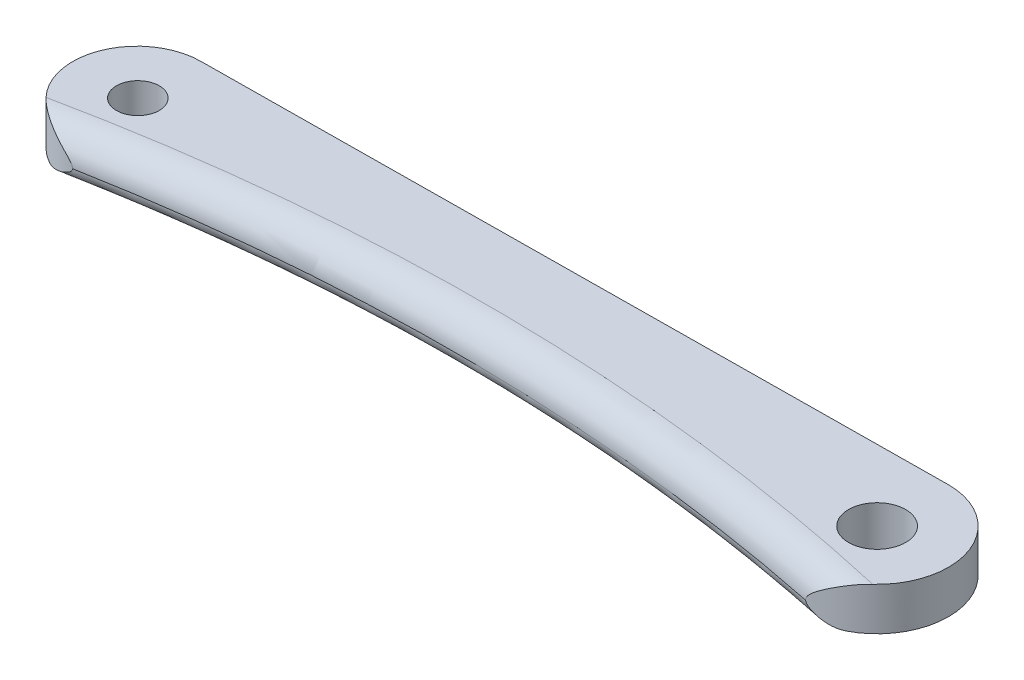
ISO-10303-21;
HEADER;
FILE_DESCRIPTION(('STEP AP214'),'2;1');
FILE_NAME('part.step','',(''),(''),'','','');
FILE_SCHEMA(('AUTOMOTIVE_DESIGN { 1 0 10303 214 1 1 1 1 }'));
ENDSEC;
DATA;
#1=APPLICATION_CONTEXT('core data for automotive mechanical design processes');
#2=APPLICATION_PROTOCOL_DEFINITION('international standard','automotive_design',2000,#1);
#3=PRODUCT_CONTEXT('',#1,'mechanical');
#4=PRODUCT('Part','Part','',(#3));
#5=PRODUCT_RELATED_PRODUCT_CATEGORY('part','',(#4));
#6=PRODUCT_DEFINITION_FORMATION('','',#4);
#7=PRODUCT_DEFINITION_CONTEXT('part definition',#1,'design');
#8=PRODUCT_DEFINITION('design','',#6,#7);
#9=PRODUCT_DEFINITION_SHAPE('','',#8);
#10=(LENGTH_UNIT() NAMED_UNIT(*) SI_UNIT(.MILLI.,.METRE.));
#11=(NAMED_UNIT(*) PLANE_ANGLE_UNIT() SI_UNIT($,.RADIAN.));
#12=(NAMED_UNIT(*) SI_UNIT($,.STERADIAN.) SOLID_ANGLE_UNIT());
#13=UNCERTAINTY_MEASURE_WITH_UNIT(LENGTH_MEASURE(1.E-05),#10,'distance_accuracy_value','');
#14=(GEOMETRIC_REPRESENTATION_CONTEXT(3) GLOBAL_UNCERTAINTY_ASSIGNED_CONTEXT((#13)) GLOBAL_UNIT_ASSIGNED_CONTEXT((#10,
#11,#12)) REPRESENTATION_CONTEXT('',''));
#15=CARTESIAN_POINT('',(0.,0.,0.));
#16=DIRECTION('',(0.,0.,1.));
#17=DIRECTION('',(1.,0.,0.));
#18=AXIS2_PLACEMENT_3D('',#15,#16,#17);
#19=CARTESIAN_POINT('',(24.616944980695,1.,137.6745));
#20=DIRECTION('',(0.,1.,0.));
#21=DIRECTION('',(0.,0.,1.));
#22=AXIS2_PLACEMENT_3D('',#19,#20,#21);
#23=TOROIDAL_SURFACE('',#22,136.430577900386,1.);
#24=CARTESIAN_POINT('',(24.616944980695,1.,137.6745));
#25=DIRECTION('',(0.,1.,0.));
#26=DIRECTION('',(0.,0.,1.));
#27=AXIS2_PLACEMENT_3D('',#24,#25,#26);
#28=CIRCLE('',#27,135.430577900386);
#29=CARTESIAN_POINT('',(51.8,1.00000000000013,5.));
#30=VERTEX_POINT('',#29);
#31=CARTESIAN_POINT('',(0.,1.,4.5));
#32=VERTEX_POINT('',#31);
#33=EDGE_CURVE('E102',#30,#32,#28,.T.);
#34=ORIENTED_EDGE('',*,*,#33,.T.);
#35=CARTESIAN_POINT('',(-2.22624692483043,0.,3.9107319813154));
#36=CARTESIAN_POINT('',(-2.16803196142417,2.42171631782831E-05,3.94388281091818));
#37=CARTESIAN_POINT('',(-2.10912387109141,0.0028956414787861,3.97568529853656));
#38=CARTESIAN_POINT('',(-1.9904022485435,0.0135807149759644,4.03642339313016));
#39=CARTESIAN_POINT('',(-1.93059040520456,0.0213860465112248,4.06536373038647));
#40=CARTESIAN_POINT('',(-1.81030235527459,0.0411986537468926,4.12033852220439));
#41=CARTESIAN_POINT('',(-1.74982571943408,0.0532088201405405,4.14637096139502));
#42=CARTESIAN_POINT('',(-1.62848960602747,0.0808604566737591,4.19551045488819));
#43=CARTESIAN_POINT('',(-1.56762994348653,0.096503837326293,4.21861596015936));
#44=CARTESIAN_POINT('',(-1.41706518136261,0.139055686671996,4.2721154636808));
#45=CARTESIAN_POINT('',(-1.32727307556081,0.167799909100152,4.30081759691567));
#46=CARTESIAN_POINT('',(-1.14794268339514,0.23104389414821,4.35211872317752));
#47=CARTESIAN_POINT('',(-1.05840460264225,0.265547427179469,4.37471369251755));
#48=CARTESIAN_POINT('',(-0.880316664175526,0.339690015696575,4.41399269174236));
#49=CARTESIAN_POINT('',(-0.791765501601624,0.37932111486797,4.43068573275245));
#50=CARTESIAN_POINT('',(-0.660304807149358,0.442817294257837,4.45151305215598));
#51=CARTESIAN_POINT('',(-0.616728549717826,0.46464854541407,4.45775188002719));
#52=CARTESIAN_POINT('',(-0.530208291975668,0.5098499514004,4.46886763044085));
#53=CARTESIAN_POINT('',(-0.487264146520685,0.533219745989242,4.47374487039973));
#54=CARTESIAN_POINT('',(-0.410862755680278,0.576971564818728,4.48133418549618));
#55=CARTESIAN_POINT('',(-0.377232634322555,0.597010788162913,4.48428438711307));
#56=CARTESIAN_POINT('',(-0.310815524196229,0.638692268054609,4.48937650031995));
#57=CARTESIAN_POINT('',(-0.278030086794347,0.660337225234645,4.49151701148303));
#58=CARTESIAN_POINT('',(-0.214139264382031,0.705714980437638,4.49501565285995));
#59=CARTESIAN_POINT('',(-0.183026527479306,0.729437185719249,4.49637751320429));
#60=CARTESIAN_POINT('',(-0.123602979962018,0.780221875363413,4.49839755676597));
#61=CARTESIAN_POINT('',(-0.0952801116445299,0.807268736610092,4.49905890063733));
#62=CARTESIAN_POINT('',(-0.0615106925026761,0.847772606854188,4.49958875479429));
#63=CARTESIAN_POINT('',(-0.0531105803101698,0.858713862763939,4.49969342387364));
#64=CARTESIAN_POINT('',(-0.0375699786415387,0.881479219008316,4.49984973381849));
#65=CARTESIAN_POINT('',(-0.0304296478693595,0.893303430308675,4.49990136800672));
#66=CARTESIAN_POINT('',(-0.0178694015559141,0.918112619379095,4.49996903269447));
#67=CARTESIAN_POINT('',(-0.012480008685361,0.931113606096959,4.49998445801709));
#68=CARTESIAN_POINT('',(-0.0043808917696035,0.957919001280434,4.49999974783877));
#69=CARTESIAN_POINT('',(-0.00166073561341566,0.971720056907016,4.49999967316143));
#70=CARTESIAN_POINT('',(0.000384009115784675,0.997744902375465,4.500000217296));
#71=CARTESIAN_POINT('',(0.000107327630633194,1.00993802413004,4.50000074639382));
#72=CARTESIAN_POINT('',(-0.00278711724042367,1.03422094180469,4.49999884735859));
#73=CARTESIAN_POINT('',(-0.00543785354551768,1.0463068531368,4.49999637739962));
#74=CARTESIAN_POINT('',(-0.00921223452798543,1.05801114783593,4.49999057051623));
#75=B_SPLINE_CURVE_WITH_KNOTS('',3,(#35,#36,#37,#38,#39,#40,#41,#42,#43,#44,#45,#46,#47,#48,#49,
#50,#51,#52,#53,#54,#55,#56,#57,#58,#59,#60,#61,#62,#63,#64,#65,#66,#67,#68,#69,#70,#71,#72,#73,
#74),.UNSPECIFIED.,.F.,.F.,(4,2,2,2,2,2,2,2,2,2,2,2,2,2,2,2,2,2,2,4),(0.,0.200806754745089,
0.401275886329909,0.60188310570669,0.802596053484626,1.09783088958517,1.39325976875211,
1.68823561610348,1.835611581135,1.98295316080637,2.10069795732786,2.21864548209201,
2.33602313971435,2.45286891640173,2.49419015574632,2.53551659692067,2.57752897654554,
2.61937649839522,2.65573277149919,2.69260195898539),.UNSPECIFIED.);
#76=CARTESIAN_POINT('',(-2.22624692483043,0.,3.9107319813154));
#77=VERTEX_POINT('',#76);
#78=EDGE_CURVE('E12',#77,#32,#75,.T.);
#79=ORIENTED_EDGE('',*,*,#78,.F.);
#80=CARTESIAN_POINT('',(24.616944980695,0.,137.6745));
#81=DIRECTION('',(0.,1.,0.));
#82=DIRECTION('',(0.,0.,1.));
#83=AXIS2_PLACEMENT_3D('',#80,#81,#82);
#84=CIRCLE('',#83,136.430577900386);
#85=CARTESIAN_POINT('',(54.0617013237156,0.,4.45922718890874));
#86=VERTEX_POINT('',#85);
#87=EDGE_CURVE('E47',#86,#77,#84,.T.);
#88=ORIENTED_EDGE('',*,*,#87,.F.);
#89=CARTESIAN_POINT('',(51.7999999999999,1.00000000000013,5.));
#90=CARTESIAN_POINT('',(51.7999559988183,0.987175402377328,4.9999987063473));
#91=CARTESIAN_POINT('',(51.8012277738419,0.974416398541732,5.00000010153782));
#92=CARTESIAN_POINT('',(51.8059676585103,0.949520714592626,4.99999730538752));
#93=CARTESIAN_POINT('',(51.8093992999422,0.937377250382461,4.99999320555364));
#94=CARTESIAN_POINT('',(51.8196822087669,0.909303513344271,4.99996457687972));
#95=CARTESIAN_POINT('',(51.827335559749,0.893675574032456,4.99993291604698));
#96=CARTESIAN_POINT('',(51.8449486640246,0.863678984547503,4.9998058307698));
#97=CARTESIAN_POINT('',(51.8549262865243,0.849321345194542,4.99970990091287));
#98=CARTESIAN_POINT('',(51.8795727892077,0.81767207394208,4.99938604088421));
#99=CARTESIAN_POINT('',(51.8947525280233,0.800785958368108,4.99912722950883));
#100=CARTESIAN_POINT('',(51.9266456787659,0.768515485314868,4.99842161242411));
#101=CARTESIAN_POINT('',(51.9433622401645,0.753134351396008,4.99797441361467));
#102=CARTESIAN_POINT('',(51.9950948568139,0.708588179313152,4.9963108434222));
#103=CARTESIAN_POINT('',(52.0315760524555,0.681152320401152,4.99477349135711));
#104=CARTESIAN_POINT('',(52.1014701169754,0.632600887554081,4.99101052694932));
#105=CARTESIAN_POINT('',(52.1346534573106,0.611128924270308,4.98890236815499));
#106=CARTESIAN_POINT('',(52.2019636801827,0.569801137168604,4.9839304887849));
#107=CARTESIAN_POINT('',(52.2360906978652,0.549945546456947,4.98106665948131));
#108=CARTESIAN_POINT('',(52.3395417005954,0.492203332450051,4.97128684786883));
#109=CARTESIAN_POINT('',(52.4098155565733,0.456219986650691,4.96318864293227));
#110=CARTESIAN_POINT('',(52.55179524957,0.388067120826566,4.94367847251809));
#111=CARTESIAN_POINT('',(52.6235024147318,0.355901349786676,4.93226328696571));
#112=CARTESIAN_POINT('',(52.7677088097081,0.295123072056276,4.90600700594135));
#113=CARTESIAN_POINT('',(52.8402072027505,0.266507145215492,4.89116924804526));
#114=CARTESIAN_POINT('',(52.9855407816728,0.212909693542131,4.85798691723392));
#115=CARTESIAN_POINT('',(53.0583747521827,0.187919664807766,4.83965079106857));
#116=CARTESIAN_POINT('',(53.2042940101168,0.14179539604979,4.7993426763248));
#117=CARTESIAN_POINT('',(53.2773793748726,0.120662475707078,4.77736944822406));
#118=CARTESIAN_POINT('',(53.4230751303446,0.0828825856393767,4.72984792052288));
#119=CARTESIAN_POINT('',(53.4956858474793,0.0662106571556643,4.70432078074652));
#120=CARTESIAN_POINT('',(53.6404913267055,0.0378961553149177,4.64957952833444));
#121=CARTESIAN_POINT('',(53.7126861091027,0.0262533343515136,4.62036559730816));
#122=CARTESIAN_POINT('',(53.8791074189494,0.00612848978246462,4.54839579489708));
#123=CARTESIAN_POINT('',(53.9730502958901,-0.000175848732147435,4.50428552397702));
#124=CARTESIAN_POINT('',(54.1120941074347,9.41218296800092E-05,4.43361728809853));
#125=CARTESIAN_POINT('',(54.1583165864682,0.00183269457594044,4.40920084379839));
#126=CARTESIAN_POINT('',(54.2498123933503,0.00903809327004083,4.35903134657077));
#127=CARTESIAN_POINT('',(54.2950843078079,0.0145101145892124,4.33327647732466));
#128=CARTESIAN_POINT('',(54.339723627424,0.0220633748222029,4.30694832756379));
#129=B_SPLINE_CURVE_WITH_KNOTS('',3,(#89,#90,#91,#92,#93,#94,#95,#96,#97,#98,#99,#100,#101,#102,
#103,#104,#105,#106,#107,#108,#109,#110,#111,#112,#113,#114,#115,#116,#117,#118,#119,#120,#121,
#122,#123,#124,#125,#126,#127,#128),.UNSPECIFIED.,.F.,.F.,(4,2,2,2,2,2,2,2,2,2,2,2,2,2,2,2,2,2,
2,4),(0.,0.0383058435442699,0.0759816524406598,0.127889414839791,0.180210248317969,
0.248167535665362,0.316267334566423,0.4529925042749,0.571692904116078,0.690410392201524,
0.928275000745676,1.16637130056692,1.40423639129747,1.64153426716498,1.87891318115535,
2.11493481592809,2.35094482893235,2.66189836997958,2.81867080052313,2.97566183772119),.UNSPECIFIED.);
#130=EDGE_CURVE('E154',#30,#86,#129,.T.);
#131=ORIENTED_EDGE('',*,*,#130,.F.);
#132=EDGE_LOOP('',(#34,#79,#88,#131));
#133=FACE_BOUND('',#132,.T.);
#134=ADVANCED_FACE('F35',(#133),#23,.T.);
#135=CARTESIAN_POINT('',(24.616944980695,1.,137.6745));
#136=DIRECTION('',(0.,1.,0.));
#137=DIRECTION('',(0.,0.,1.));
#138=AXIS2_PLACEMENT_3D('',#135,#136,#137);
#139=TOROIDAL_SURFACE('',#138,137.430577900386,2.);
#140=ORIENTED_EDGE('',*,*,#33,.F.);
#141=CARTESIAN_POINT('',(55.179170688117,3.,3.68526870941198));
#142=CARTESIAN_POINT('',(55.1159229429357,2.99999481933412,3.74328639692364));
#143=CARTESIAN_POINT('',(55.0512119671688,2.99626071571403,3.79960204284192));
#144=CARTESIAN_POINT('',(54.9195381227405,2.98214700773226,3.90841608687958));
#145=CARTESIAN_POINT('',(54.852579585343,2.97177955998762,3.96092127266407));
#146=CARTESIAN_POINT('',(54.7177372805287,2.94537935449713,4.06125532239149));
#147=CARTESIAN_POINT('',(54.6498770564928,2.929422440967,4.10913635202487));
#148=CARTESIAN_POINT('',(54.5127892968723,2.89250455100303,4.2009023387452));
#149=CARTESIAN_POINT('',(54.4435610003267,2.87154071336119,4.2447849910776));
#150=CARTESIAN_POINT('',(54.2799331618191,2.81719151354904,4.34303212362));
#151=CARTESIAN_POINT('',(54.1851354487382,2.78202016742679,4.39574945935869));
#152=CARTESIAN_POINT('',(53.9945083460966,2.70498976013333,4.49395597560691));
#153=CARTESIAN_POINT('',(53.8986785285522,2.66312781649614,4.53944202378402));
#154=CARTESIAN_POINT('',(53.7057488420745,2.57331618223374,4.62377587740515));
#155=CARTESIAN_POINT('',(53.6086453198939,2.52531491805368,4.66256001003192));
#156=CARTESIAN_POINT('',(53.4146152937753,2.42429900968213,4.73325218361756));
#157=CARTESIAN_POINT('',(53.3176887366448,2.37128627493276,4.76516282840144));
#158=CARTESIAN_POINT('',(53.1208746092861,2.25861667913632,4.82350611032762));
#159=CARTESIAN_POINT('',(53.021012836432,2.19878488452465,4.84968747739433));
#160=CARTESIAN_POINT('',(52.8226469598733,2.0742290516696,4.89536207339637));
#161=CARTESIAN_POINT('',(52.7241448048733,2.00949871081684,4.91484650100954));
#162=CARTESIAN_POINT('',(52.5306364215458,1.87527283264607,4.94728819513373));
#163=CARTESIAN_POINT('',(52.4356063385429,1.80582671795867,4.96030397009618));
#164=CARTESIAN_POINT('',(52.2970815559914,1.69618935362546,4.97544744386267));
#165=CARTESIAN_POINT('',(52.2516223547528,1.65877438064956,4.97976299374628));
#166=CARTESIAN_POINT('',(52.1627274451337,1.58150492424973,4.98702357077112));
#167=CARTESIAN_POINT('',(52.1192902337507,1.54165230548819,4.98996963101922));
#168=CARTESIAN_POINT('',(52.0501145860273,1.47276690001795,4.99381624134142));
#169=CARTESIAN_POINT('',(52.0234215460558,1.44471935287894,4.99507181129693));
#170=CARTESIAN_POINT('',(51.9721028869513,1.38654632983971,4.9971031477401));
#171=CARTESIAN_POINT('',(51.9474855986659,1.35641328962607,4.9978770536244));
#172=CARTESIAN_POINT('',(51.9013325192451,1.29308884116162,4.99902694700277));
#173=CARTESIAN_POINT('',(51.879850067623,1.25985745475778,4.99939661793745));
#174=CARTESIAN_POINT('',(51.8429719805347,1.19036203983548,4.99984909168904));
#175=CARTESIAN_POINT('',(51.8275179226604,1.15413146656946,4.99993471152447));
#176=CARTESIAN_POINT('',(51.810298969956,1.09380471650876,4.99999425471497));
#177=CARTESIAN_POINT('',(51.8055364318497,1.07058689191634,4.99999898871853));
#178=CARTESIAN_POINT('',(51.7999473944921,1.0233137238559,4.99999948772581));
#179=CARTESIAN_POINT('',(51.7991859442435,0.999250905134058,4.99999510611064));
#180=CARTESIAN_POINT('',(51.8007632686115,0.975240894652573,4.9999999417421));
#181=B_SPLINE_CURVE_WITH_KNOTS('',3,(#141,#142,#143,#144,#145,#146,#147,#148,#149,#150,#151,
#152,#153,#154,#155,#156,#157,#158,#159,#160,#161,#162,#163,#164,#165,#166,#167,#168,#169,#170,
#171,#172,#173,#174,#175,#176,#177,#178,#179,#180),.UNSPECIFIED.,.F.,.F.,(4,2,2,2,2,2,2,2,2,2,2,
2,2,2,2,2,2,2,2,4),(0.,0.257268129629723,0.514066121323012,0.767506569513693,1.02109219430181,
1.36267802921334,1.70441142596798,2.04923161494704,2.39392094799241,2.75157860618292,
3.10970452760377,3.46452943577572,3.64157017571894,3.81847714318946,3.93462135679894,
4.05121147968662,4.16959849382825,4.28680786251461,4.35758788907899,4.42951516277919),.UNSPECIFIED.);
#182=CARTESIAN_POINT('',(55.179170688117,3.,3.68526870941198));
#183=VERTEX_POINT('',#182);
#184=EDGE_CURVE('E149',#183,#30,#181,.T.);
#185=ORIENTED_EDGE('',*,*,#184,.F.);
#186=CARTESIAN_POINT('',(24.616944980695,3.,137.6745));
#187=DIRECTION('',(0.,1.,0.));
#188=DIRECTION('',(0.,0.,1.));
#189=AXIS2_PLACEMENT_3D('',#186,#187,#188);
#190=CIRCLE('',#189,137.430577900386);
#191=CARTESIAN_POINT('',(-3.26083189496921,3.,3.10112485281575));
#192=VERTEX_POINT('',#191);
#193=EDGE_CURVE('E89',#192,#183,#190,.F.);
#194=ORIENTED_EDGE('',*,*,#193,.F.);
#195=CARTESIAN_POINT('',(2.05187685361144E-13,1.,4.5));
#196=CARTESIAN_POINT('',(0.000105215794035733,1.02476925164426,4.49999459809834));
#197=CARTESIAN_POINT('',(-0.0025298652948166,1.04936001533275,4.50000062029043));
#198=CARTESIAN_POINT('',(-0.012171592814855,1.09716468143189,4.49998734612933));
#199=CARTESIAN_POINT('',(-0.0190863025297015,1.12039657317255,4.49996857305866));
#200=CARTESIAN_POINT('',(-0.0402989855534702,1.17615597501097,4.49983600515036));
#201=CARTESIAN_POINT('',(-0.0565401781057808,1.20791272057776,4.49968164911853));
#202=CARTESIAN_POINT('',(-0.0934755137653292,1.26904276099404,4.49906801190616));
#203=CARTESIAN_POINT('',(-0.114217961944437,1.29838502185107,4.49860530031251));
#204=CARTESIAN_POINT('',(-0.172477614742557,1.37320954484304,4.49683771710686));
#205=CARTESIAN_POINT('',(-0.212201732576446,1.41693107976089,4.49518256172003));
#206=CARTESIAN_POINT('',(-0.295098807337685,1.50094376951325,4.49050863569963));
#207=CARTESIAN_POINT('',(-0.338280552202158,1.54122560877682,4.48748629344408));
#208=CARTESIAN_POINT('',(-0.42676551761521,1.61952618299789,4.47993833801163));
#209=CARTESIAN_POINT('',(-0.472075081855962,1.65753726742775,4.47540794760775));
#210=CARTESIAN_POINT('',(-0.563891698023222,1.73171998004738,4.46476950128661));
#211=CARTESIAN_POINT('',(-0.610397343765677,1.76789363176549,4.4586632280119));
#212=CARTESIAN_POINT('',(-0.765147115808477,1.88487195987099,4.43580888146256));
#213=CARTESIAN_POINT('',(-0.875176842951073,1.96266382292513,4.41553545310959));
#214=CARTESIAN_POINT('',(-1.09724570022232,2.11237968764182,4.36566887410921));
#215=CARTESIAN_POINT('',(-1.20928697026066,2.18429692570062,4.33606516652697));
#216=CARTESIAN_POINT('',(-1.43384456078392,2.32186481296055,4.26706541592752));
#217=CARTESIAN_POINT('',(-1.54635910230782,2.38753004959685,4.22769298105942));
#218=CARTESIAN_POINT('',(-1.77104508586655,2.51184625051008,4.13859827958693));
#219=CARTESIAN_POINT('',(-1.88321674024875,2.57050322150966,4.08888497769951));
#220=CARTESIAN_POINT('',(-2.13739644870769,2.69458841329829,3.96318756311508));
#221=CARTESIAN_POINT('',(-2.27902802749552,2.75736427086557,3.88374228884946));
#222=CARTESIAN_POINT('',(-2.55716678398448,2.86455037425043,3.70646331975199));
#223=CARTESIAN_POINT('',(-2.69369335375538,2.90903832158002,3.60871004650351));
#224=CARTESIAN_POINT('',(-2.87754781734653,2.95411677163155,3.46036930806297));
#225=CARTESIAN_POINT('',(-2.92857200630546,2.96494233953057,3.41730391887934));
#226=CARTESIAN_POINT('',(-3.02903309795288,2.98248396447107,3.3285793760516));
#227=CARTESIAN_POINT('',(-3.07847070086377,2.98920185869571,3.28292139196267));
#228=CARTESIAN_POINT('',(-3.17587169686235,2.99813610466408,3.18880182361722));
#229=CARTESIAN_POINT('',(-3.22381885171535,3.00031343786831,3.14031958909397));
#230=CARTESIAN_POINT('',(-3.31750985185635,2.9996127428148,3.0411866094801));
#231=CARTESIAN_POINT('',(-3.36325056351318,2.99672773021214,2.99053296264705));
#232=CARTESIAN_POINT('',(-3.40768033339295,2.99108877267361,2.93899893593157));
#233=B_SPLINE_CURVE_WITH_KNOTS('',3,(#195,#196,#197,#198,#199,#200,#201,#202,#203,#204,#205,
#206,#207,#208,#209,#210,#211,#212,#213,#214,#215,#216,#217,#218,#219,#220,#221,#222,#223,#224,
#225,#226,#227,#228,#229,#230,#231,#232),.UNSPECIFIED.,.F.,.F.,(4,2,2,2,2,2,2,2,2,2,2,2,2,2,2,2,
2,2,4),(0.,0.0738848298879506,0.146235029831824,0.252634652556451,0.36023816835541,
0.537066703860971,0.714359875883279,0.892220112316175,1.06988002802908,1.47813663824047,
1.88685684716217,2.29459875960808,2.70198865423507,3.22265698239322,3.74108964650981,
3.94386012870148,4.14653985404177,4.35095421453034,4.55565082029057),.UNSPECIFIED.);
#234=EDGE_CURVE('E126',#32,#192,#233,.T.);
#235=ORIENTED_EDGE('',*,*,#234,.F.);
#236=EDGE_LOOP('',(#140,#185,#194,#235));
#237=FACE_BOUND('',#236,.T.);
#238=ADVANCED_FACE('F133',(#237),#139,.T.);
#239=CARTESIAN_POINT('',(51.8,3.,0.));
#240=DIRECTION('',(0.,-1.,0.));
#241=DIRECTION('',(0.,0.,-1.));
#242=AXIS2_PLACEMENT_3D('',#239,#240,#241);
#243=CYLINDRICAL_SURFACE('',#242,5.);
#244=ORIENTED_EDGE('',*,*,#184,.T.);
#245=ORIENTED_EDGE('',*,*,#130,.T.);
#246=CARTESIAN_POINT('',(51.8,0.,0.));
#247=DIRECTION('',(0.,1.,0.));
#248=DIRECTION('',(0.,0.,1.));
#249=AXIS2_PLACEMENT_3D('',#246,#247,#248);
#250=CIRCLE('',#249,5.);
#251=CARTESIAN_POINT('',(51.8,0.,-5.));
#252=VERTEX_POINT('',#251);
#253=EDGE_CURVE('E98',#86,#252,#250,.T.);
#254=ORIENTED_EDGE('',*,*,#253,.T.);
#255=DIRECTION('',(0.,-1.,0.));
#256=VECTOR('',#255,1.);
#257=CARTESIAN_POINT('',(51.8,3.,-5.));
#258=LINE('',#257,#256);
#259=CARTESIAN_POINT('',(51.8,3.,-5.));
#260=VERTEX_POINT('',#259);
#261=EDGE_CURVE('E95',#260,#252,#258,.T.);
#262=ORIENTED_EDGE('',*,*,#261,.F.);
#263=CARTESIAN_POINT('',(51.8,3.,0.));
#264=DIRECTION('',(0.,1.,0.));
#265=DIRECTION('',(0.,0.,1.));
#266=AXIS2_PLACEMENT_3D('',#263,#264,#265);
#267=CIRCLE('',#266,5.);
#268=EDGE_CURVE('E82',#183,#260,#267,.T.);
#269=ORIENTED_EDGE('',*,*,#268,.F.);
#270=EDGE_LOOP('',(#244,#245,#254,#262,#269));
#271=FACE_BOUND('',#270,.T.);
#272=ADVANCED_FACE('F96',(#271),#243,.T.);
#273=CARTESIAN_POINT('',(-0.0434322468129188,3.,-4.49958076981841));
#274=DIRECTION('',(-0.00965206001721773,0.,-0.999953417783761));
#275=DIRECTION('',(-0.999953417783761,0.,0.00965206001721773));
#276=AXIS2_PLACEMENT_3D('',#273,#274,#275);
#277=PLANE('',#276);
#278=DIRECTION('',(0.999953417783761,0.,-0.00965206001721773));
#279=VECTOR('',#278,1.);
#280=CARTESIAN_POINT('',(-0.0434322468129188,0.,-4.49958076981841));
#281=LINE('',#280,#279);
#282=CARTESIAN_POINT('',(0.,0.,-4.5));
#283=VERTEX_POINT('',#282);
#284=EDGE_CURVE('E116',#283,#252,#281,.T.);
#285=ORIENTED_EDGE('',*,*,#284,.F.);
#286=DIRECTION('',(0.,-1.,0.));
#287=VECTOR('',#286,1.);
#288=CARTESIAN_POINT('',(0.,3.,-4.5));
#289=LINE('',#288,#287);
#290=CARTESIAN_POINT('',(0.,3.,-4.5));
#291=VERTEX_POINT('',#290);
#292=EDGE_CURVE('E103',#291,#283,#289,.T.);
#293=ORIENTED_EDGE('',*,*,#292,.F.);
#294=DIRECTION('',(0.999953417783761,0.,-0.00965206001721773));
#295=VECTOR('',#294,1.);
#296=CARTESIAN_POINT('',(-0.0434322468129188,3.,-4.49958076981841));
#297=LINE('',#296,#295);
#298=EDGE_CURVE('E88',#291,#260,#297,.T.);
#299=ORIENTED_EDGE('',*,*,#298,.T.);
#300=ORIENTED_EDGE('',*,*,#261,.T.);
#301=EDGE_LOOP('',(#285,#293,#299,#300));
#302=FACE_BOUND('',#301,.T.);
#303=ADVANCED_FACE('F105',(#302),#277,.T.);
#304=CARTESIAN_POINT('',(0.,3.,0.));
#305=DIRECTION('',(0.,-1.,0.));
#306=DIRECTION('',(0.,0.,-1.));
#307=AXIS2_PLACEMENT_3D('',#304,#305,#306);
#308=CYLINDRICAL_SURFACE('',#307,4.5);
#309=CARTESIAN_POINT('',(0.,0.,0.));
#310=DIRECTION('',(0.,1.,0.));
#311=DIRECTION('',(0.,0.,1.));
#312=AXIS2_PLACEMENT_3D('',#309,#310,#311);
#313=CIRCLE('',#312,4.5);
#314=EDGE_CURVE('E119',#283,#77,#313,.T.);
#315=ORIENTED_EDGE('',*,*,#314,.T.);
#316=ORIENTED_EDGE('',*,*,#78,.T.);
#317=ORIENTED_EDGE('',*,*,#234,.T.);
#318=CARTESIAN_POINT('',(0.,3.,0.));
#319=DIRECTION('',(0.,1.,0.));
#320=DIRECTION('',(0.,0.,1.));
#321=AXIS2_PLACEMENT_3D('',#318,#319,#320);
#322=CIRCLE('',#321,4.5);
#323=EDGE_CURVE('E107',#291,#192,#322,.T.);
#324=ORIENTED_EDGE('',*,*,#323,.F.);
#325=ORIENTED_EDGE('',*,*,#292,.T.);
#326=EDGE_LOOP('',(#315,#316,#317,#324,#325));
#327=FACE_BOUND('',#326,.T.);
#328=ADVANCED_FACE('F136',(#327),#308,.T.);
#329=CARTESIAN_POINT('',(51.8,3.,0.));
#330=DIRECTION('',(0.,-1.,0.));
#331=DIRECTION('',(0.,0.,-1.));
#332=AXIS2_PLACEMENT_3D('',#329,#330,#331);
#333=CYLINDRICAL_SURFACE('',#332,2.);
#334=CARTESIAN_POINT('',(51.8,3.,0.));
#335=DIRECTION('',(0.,1.,0.));
#336=DIRECTION('',(0.,0.,1.));
#337=AXIS2_PLACEMENT_3D('',#334,#335,#336);
#338=CIRCLE('',#337,2.);
#339=CARTESIAN_POINT('',(51.8,3.,2.));
#340=VERTEX_POINT('',#339);
#341=EDGE_CURVE('E109',#340,#340,#338,.T.);
#342=ORIENTED_EDGE('',*,*,#341,.T.);
#343=EDGE_LOOP('',(#342));
#344=FACE_BOUND('',#343,.T.);
#345=CARTESIAN_POINT('',(51.8,0.,0.));
#346=DIRECTION('',(0.,1.,0.));
#347=DIRECTION('',(0.,0.,1.));
#348=AXIS2_PLACEMENT_3D('',#345,#346,#347);
#349=CIRCLE('',#348,2.);
#350=CARTESIAN_POINT('',(51.8,0.,2.));
#351=VERTEX_POINT('',#350);
#352=EDGE_CURVE('E92',#351,#351,#349,.T.);
#353=ORIENTED_EDGE('',*,*,#352,.F.);
#354=EDGE_LOOP('',(#353));
#355=FACE_BOUND('',#354,.T.);
#356=ADVANCED_FACE('F141',(#344,#355),#333,.F.);
#357=CARTESIAN_POINT('',(0.,3.,0.));
#358=DIRECTION('',(0.,1.,0.));
#359=DIRECTION('',(0.,0.,1.));
#360=AXIS2_PLACEMENT_3D('',#357,#358,#359);
#361=PLANE('',#360);
#362=ORIENTED_EDGE('',*,*,#323,.T.);
#363=ORIENTED_EDGE('',*,*,#193,.T.);
#364=ORIENTED_EDGE('',*,*,#268,.T.);
#365=ORIENTED_EDGE('',*,*,#298,.F.);
#366=EDGE_LOOP('',(#362,#363,#364,#365));
#367=FACE_BOUND('',#366,.T.);
#368=CARTESIAN_POINT('',(3.90750325257866E-05,3.,-0.0636252453191284));
#369=DIRECTION('',(0.,1.,0.));
#370=DIRECTION('',(0.,0.,1.));
#371=AXIS2_PLACEMENT_3D('',#368,#369,#370);
#372=CIRCLE('',#371,1.5);
#373=CARTESIAN_POINT('',(3.90750325257866E-05,3.,-1.56362524531913));
#374=VERTEX_POINT('',#373);
#375=EDGE_CURVE('E117',#374,#374,#372,.F.);
#376=ORIENTED_EDGE('',*,*,#375,.T.);
#377=EDGE_LOOP('',(#376));
#378=FACE_BOUND('',#377,.T.);
#379=ORIENTED_EDGE('',*,*,#341,.F.);
#380=EDGE_LOOP('',(#379));
#381=FACE_BOUND('',#380,.T.);
#382=ADVANCED_FACE('F85',(#367,#378,#381),#361,.T.);
#383=CARTESIAN_POINT('',(0.,0.,0.));
#384=DIRECTION('',(0.,1.,0.));
#385=DIRECTION('',(0.,0.,1.));
#386=AXIS2_PLACEMENT_3D('',#383,#384,#385);
#387=PLANE('',#386);
#388=CARTESIAN_POINT('',(3.90750325257866E-05,0.,-0.0636252453191284));
#389=DIRECTION('',(0.,-1.,0.));
#390=DIRECTION('',(0.,0.,-1.));
#391=AXIS2_PLACEMENT_3D('',#388,#389,#390);
#392=CIRCLE('',#391,1.5);
#393=CARTESIAN_POINT('',(3.90750325257866E-05,0.,-1.56362524531913));
#394=VERTEX_POINT('',#393);
#395=EDGE_CURVE('E252',#394,#394,#392,.T.);
#396=ORIENTED_EDGE('',*,*,#395,.F.);
#397=EDGE_LOOP('',(#396));
#398=FACE_BOUND('',#397,.T.);
#399=ORIENTED_EDGE('',*,*,#253,.F.);
#400=ORIENTED_EDGE('',*,*,#87,.T.);
#401=ORIENTED_EDGE('',*,*,#314,.F.);
#402=ORIENTED_EDGE('',*,*,#284,.T.);
#403=EDGE_LOOP('',(#399,#400,#401,#402));
#404=FACE_BOUND('',#403,.T.);
#405=ORIENTED_EDGE('',*,*,#352,.T.);
#406=EDGE_LOOP('',(#405));
#407=FACE_BOUND('',#406,.T.);
#408=ADVANCED_FACE('F160',(#398,#404,#407),#387,.F.);
#409=CARTESIAN_POINT('',(3.90750325257866E-05,7.24264068711929,-0.0636252453191284));
#410=DIRECTION('',(0.,-1.,0.));
#411=DIRECTION('',(0.,0.,-1.));
#412=AXIS2_PLACEMENT_3D('',#409,#410,#411);
#413=CYLINDRICAL_SURFACE('',#412,1.5);
#414=CARTESIAN_POINT('',(3.90750325257866E-05,0.,-1.56362524531913));
#415=CARTESIAN_POINT('',(3.90750325257866E-05,0.03125,-1.56362524531913));
#416=CARTESIAN_POINT('',(3.90750325257866E-05,0.0625000000000001,-1.56362524531913));
#417=CARTESIAN_POINT('',(3.90750325257866E-05,0.125,-1.56362524531913));
#418=CARTESIAN_POINT('',(3.90750325257866E-05,0.15625,-1.56362524531913));
#419=CARTESIAN_POINT('',(3.90750325257866E-05,0.21875,-1.56362524531913));
#420=CARTESIAN_POINT('',(3.90750325257866E-05,0.25,-1.56362524531913));
#421=CARTESIAN_POINT('',(3.90750325257866E-05,0.3125,-1.56362524531913));
#422=CARTESIAN_POINT('',(3.90750325257866E-05,0.34375,-1.56362524531913));
#423=CARTESIAN_POINT('',(3.90750325257866E-05,0.40625,-1.56362524531913));
#424=CARTESIAN_POINT('',(3.90750325257866E-05,0.4375,-1.56362524531913));
#425=CARTESIAN_POINT('',(3.90750325257866E-05,0.5,-1.56362524531913));
#426=CARTESIAN_POINT('',(3.90750325257866E-05,0.53125,-1.56362524531913));
#427=CARTESIAN_POINT('',(3.90750325257866E-05,0.59375,-1.56362524531913));
#428=CARTESIAN_POINT('',(3.90750325257866E-05,0.625,-1.56362524531913));
#429=CARTESIAN_POINT('',(3.90750325257866E-05,0.6875,-1.56362524531913));
#430=CARTESIAN_POINT('',(3.90750325257866E-05,0.71875,-1.56362524531913));
#431=CARTESIAN_POINT('',(3.90750325257866E-05,0.78125,-1.56362524531913));
#432=CARTESIAN_POINT('',(3.90750325257866E-05,0.8125,-1.56362524531913));
#433=CARTESIAN_POINT('',(3.90750325257866E-05,0.875,-1.56362524531913));
#434=CARTESIAN_POINT('',(3.90750325257866E-05,0.90625,-1.56362524531913));
#435=CARTESIAN_POINT('',(3.90750325257866E-05,0.96875,-1.56362524531913));
#436=CARTESIAN_POINT('',(3.90750325257866E-05,0.999999999999999,-1.56362524531913));
#437=CARTESIAN_POINT('',(3.90750325257866E-05,1.0625,-1.56362524531913));
#438=CARTESIAN_POINT('',(3.90750325257866E-05,1.09375,-1.56362524531913));
#439=CARTESIAN_POINT('',(3.90750325257866E-05,1.15625,-1.56362524531913));
#440=CARTESIAN_POINT('',(3.90750325257866E-05,1.1875,-1.56362524531913));
#441=CARTESIAN_POINT('',(3.90750325257866E-05,1.25,-1.56362524531913));
#442=CARTESIAN_POINT('',(3.90750325257866E-05,1.28125,-1.56362524531913));
#443=CARTESIAN_POINT('',(3.90750325257866E-05,1.34375,-1.56362524531913));
#444=CARTESIAN_POINT('',(3.90750325257866E-05,1.375,-1.56362524531913));
#445=CARTESIAN_POINT('',(3.90750325257866E-05,1.4375,-1.56362524531913));
#446=CARTESIAN_POINT('',(3.90750325257866E-05,1.46875,-1.56362524531913));
#447=CARTESIAN_POINT('',(3.90750325257866E-05,1.53125,-1.56362524531913));
#448=CARTESIAN_POINT('',(3.90750325257866E-05,1.5625,-1.56362524531913));
#449=CARTESIAN_POINT('',(3.90750325257866E-05,1.625,-1.56362524531913));
#450=CARTESIAN_POINT('',(3.90750325257866E-05,1.65625,-1.56362524531913));
#451=CARTESIAN_POINT('',(3.90750325257866E-05,1.71875,-1.56362524531913));
#452=CARTESIAN_POINT('',(3.90750325257866E-05,1.75,-1.56362524531913));
#453=CARTESIAN_POINT('',(3.90750325257866E-05,1.8125,-1.56362524531913));
#454=CARTESIAN_POINT('',(3.90750325257866E-05,1.84375,-1.56362524531913));
#455=CARTESIAN_POINT('',(3.90750325257866E-05,1.90625,-1.56362524531913));
#456=CARTESIAN_POINT('',(3.90750325257866E-05,1.9375,-1.56362524531913));
#457=CARTESIAN_POINT('',(3.90750325257866E-05,2.,-1.56362524531913));
#458=CARTESIAN_POINT('',(3.90750325257866E-05,2.03125,-1.56362524531913));
#459=CARTESIAN_POINT('',(3.90750325257866E-05,2.09375,-1.56362524531913));
#460=CARTESIAN_POINT('',(3.90750325257866E-05,2.125,-1.56362524531913));
#461=CARTESIAN_POINT('',(3.90750325257866E-05,2.1875,-1.56362524531913));
#462=CARTESIAN_POINT('',(3.90750325257866E-05,2.21875,-1.56362524531913));
#463=CARTESIAN_POINT('',(3.90750325257866E-05,2.28125,-1.56362524531913));
#464=CARTESIAN_POINT('',(3.90750325257866E-05,2.3125,-1.56362524531913));
#465=CARTESIAN_POINT('',(3.90750325257866E-05,2.375,-1.56362524531913));
#466=CARTESIAN_POINT('',(3.90750325257866E-05,2.40625,-1.56362524531913));
#467=CARTESIAN_POINT('',(3.90750325257866E-05,2.46875,-1.56362524531913));
#468=CARTESIAN_POINT('',(3.90750325257866E-05,2.5,-1.56362524531913));
#469=CARTESIAN_POINT('',(3.90750325257866E-05,2.5625,-1.56362524531913));
#470=CARTESIAN_POINT('',(3.90750325257866E-05,2.59375,-1.56362524531913));
#471=CARTESIAN_POINT('',(3.90750325257866E-05,2.65625,-1.56362524531913));
#472=CARTESIAN_POINT('',(3.90750325257866E-05,2.6875,-1.56362524531913));
#473=CARTESIAN_POINT('',(3.90750325257866E-05,2.75,-1.56362524531913));
#474=CARTESIAN_POINT('',(3.90750325257866E-05,2.78125,-1.56362524531913));
#475=CARTESIAN_POINT('',(3.90750325257866E-05,2.84375,-1.56362524531913));
#476=CARTESIAN_POINT('',(3.90750325257866E-05,2.875,-1.56362524531913));
#477=CARTESIAN_POINT('',(3.90750325257866E-05,2.9375,-1.56362524531913));
#478=CARTESIAN_POINT('',(3.90750325257866E-05,2.96875,-1.56362524531913));
#479=CARTESIAN_POINT('',(3.90750325257866E-05,3.,-1.56362524531913));
#480=B_SPLINE_CURVE_WITH_KNOTS('',3,(#414,#415,#416,#417,#418,#419,#420,#421,#422,#423,#424,
#425,#426,#427,#428,#429,#430,#431,#432,#433,#434,#435,#436,#437,#438,#439,#440,#441,#442,#443,
#444,#445,#446,#447,#448,#449,#450,#451,#452,#453,#454,#455,#456,#457,#458,#459,#460,#461,#462,
#463,#464,#465,#466,#467,#468,#469,#470,#471,#472,#473,#474,#475,#476,#477,#478,#479),
.UNSPECIFIED.,.F.,.F.,(4,2,2,2,2,2,2,2,2,2,2,2,2,2,2,2,2,2,2,2,2,2,2,2,2,2,2,2,2,2,2,2,4),(0.,
0.0937500000000001,0.1875,0.28125,0.375,0.46875,0.5625,0.65625,0.75,0.84375,0.9375,1.03125,
1.125,1.21875,1.3125,1.40625,1.5,1.59375,1.6875,1.78125,1.875,1.96875,2.0625,2.15625,2.25,
2.34375,2.4375,2.53125,2.625,2.71875,2.8125,2.90625,3.),.UNSPECIFIED.);
#481=EDGE_CURVE('BSEAM202',#394,#374,#480,.T.);
#482=ORIENTED_EDGE('',*,*,#395,.T.);
#483=ORIENTED_EDGE('',*,*,#375,.F.);
#484=ORIENTED_EDGE('',*,*,#481,.T.);
#485=ORIENTED_EDGE('',*,*,#481,.F.);
#486=EDGE_LOOP('',(#482,#484,#483,#485));
#487=FACE_BOUND('',#486,.T.);
#488=ADVANCED_FACE('F202',(#487),#413,.F.);
#489=CLOSED_SHELL('',(#134,#238,#272,#303,#328,#356,#382,#408,#488));
#490=MANIFOLD_SOLID_BREP('B2',#489);
#491=ADVANCED_BREP_SHAPE_REPRESENTATION('',(#18,#490),#14);
#492=SHAPE_DEFINITION_REPRESENTATION(#9,#491);
ENDSEC;
END-ISO-10303-21;
